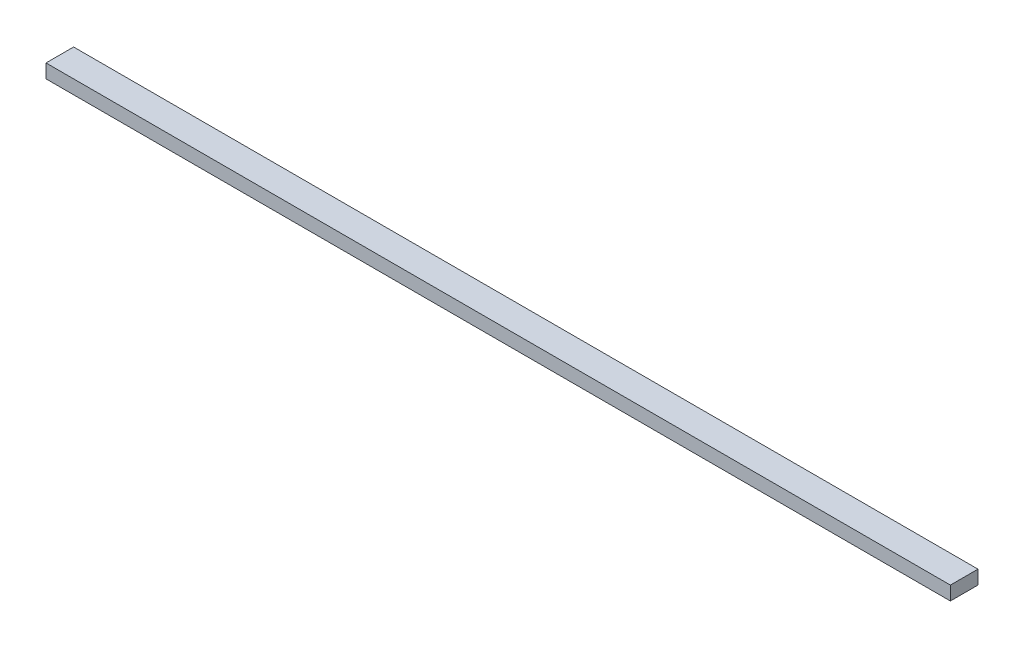
ISO-10303-21;
HEADER;
FILE_DESCRIPTION(('STEP AP214'),'2;1');
FILE_NAME('part.step','',(''),(''),'','','');
FILE_SCHEMA(('AUTOMOTIVE_DESIGN { 1 0 10303 214 1 1 1 1 }'));
ENDSEC;
DATA;
#1=APPLICATION_CONTEXT('core data for automotive mechanical design processes');
#2=APPLICATION_PROTOCOL_DEFINITION('international standard','automotive_design',2000,#1);
#3=PRODUCT_CONTEXT('',#1,'mechanical');
#4=PRODUCT('Part','Part','',(#3));
#5=PRODUCT_RELATED_PRODUCT_CATEGORY('part','',(#4));
#6=PRODUCT_DEFINITION_FORMATION('','',#4);
#7=PRODUCT_DEFINITION_CONTEXT('part definition',#1,'design');
#8=PRODUCT_DEFINITION('design','',#6,#7);
#9=PRODUCT_DEFINITION_SHAPE('','',#8);
#10=(LENGTH_UNIT() NAMED_UNIT(*) SI_UNIT(.MILLI.,.METRE.));
#11=(NAMED_UNIT(*) PLANE_ANGLE_UNIT() SI_UNIT($,.RADIAN.));
#12=(NAMED_UNIT(*) SI_UNIT($,.STERADIAN.) SOLID_ANGLE_UNIT());
#13=UNCERTAINTY_MEASURE_WITH_UNIT(LENGTH_MEASURE(1.E-05),#10,'distance_accuracy_value','');
#14=(GEOMETRIC_REPRESENTATION_CONTEXT(3) GLOBAL_UNCERTAINTY_ASSIGNED_CONTEXT((#13)) GLOBAL_UNIT_ASSIGNED_CONTEXT((#10,
#11,#12)) REPRESENTATION_CONTEXT('',''));
#15=CARTESIAN_POINT('',(0.,0.,0.));
#16=DIRECTION('',(0.,0.,1.));
#17=DIRECTION('',(1.,0.,0.));
#18=AXIS2_PLACEMENT_3D('',#15,#16,#17);
#19=CARTESIAN_POINT('',(-327.5,10.,10.));
#20=DIRECTION('',(1.,0.,0.));
#21=DIRECTION('',(0.,0.,-1.));
#22=AXIS2_PLACEMENT_3D('',#19,#20,#21);
#23=PLANE('',#22);
#24=DIRECTION('',(0.,0.,1.));
#25=VECTOR('',#24,1.);
#26=CARTESIAN_POINT('',(-327.5,0.,10.));
#27=LINE('',#26,#25);
#28=CARTESIAN_POINT('',(-327.5,0.,-9.99999999999996));
#29=VERTEX_POINT('',#28);
#30=CARTESIAN_POINT('',(-327.5,0.,10.));
#31=VERTEX_POINT('',#30);
#32=EDGE_CURVE('E99',#29,#31,#27,.T.);
#33=ORIENTED_EDGE('',*,*,#32,.T.);
#34=DIRECTION('',(0.,-1.,0.));
#35=VECTOR('',#34,1.);
#36=CARTESIAN_POINT('',(-327.5,10.,10.));
#37=LINE('',#36,#35);
#38=CARTESIAN_POINT('',(-327.5,10.,10.));
#39=VERTEX_POINT('',#38);
#40=EDGE_CURVE('E11',#39,#31,#37,.T.);
#41=ORIENTED_EDGE('',*,*,#40,.F.);
#42=DIRECTION('',(0.,0.,1.));
#43=VECTOR('',#42,1.);
#44=CARTESIAN_POINT('',(-327.5,10.,10.));
#45=LINE('',#44,#43);
#46=CARTESIAN_POINT('',(-327.5,10.,-9.99999999999996));
#47=VERTEX_POINT('',#46);
#48=EDGE_CURVE('E87',#47,#39,#45,.T.);
#49=ORIENTED_EDGE('',*,*,#48,.F.);
#50=DIRECTION('',(0.,-1.,0.));
#51=VECTOR('',#50,1.);
#52=CARTESIAN_POINT('',(-327.5,10.,-9.99999999999996));
#53=LINE('',#52,#51);
#54=EDGE_CURVE('E95',#47,#29,#53,.T.);
#55=ORIENTED_EDGE('',*,*,#54,.T.);
#56=EDGE_LOOP('',(#33,#41,#49,#55));
#57=FACE_BOUND('',#56,.T.);
#58=ADVANCED_FACE('F36',(#57),#23,.F.);
#59=CARTESIAN_POINT('',(327.5,10.,9.99999999999996));
#60=DIRECTION('',(0.,0.,-1.));
#61=DIRECTION('',(-1.,0.,0.));
#62=AXIS2_PLACEMENT_3D('',#59,#60,#61);
#63=PLANE('',#62);
#64=DIRECTION('',(1.,0.,0.));
#65=VECTOR('',#64,1.);
#66=CARTESIAN_POINT('',(327.5,0.,9.99999999999996));
#67=LINE('',#66,#65);
#68=CARTESIAN_POINT('',(327.5,0.,9.99999999999996));
#69=VERTEX_POINT('',#68);
#70=EDGE_CURVE('E91',#31,#69,#67,.T.);
#71=ORIENTED_EDGE('',*,*,#70,.T.);
#72=DIRECTION('',(0.,-1.,0.));
#73=VECTOR('',#72,1.);
#74=CARTESIAN_POINT('',(327.5,10.,9.99999999999996));
#75=LINE('',#74,#73);
#76=CARTESIAN_POINT('',(327.5,10.,9.99999999999996));
#77=VERTEX_POINT('',#76);
#78=EDGE_CURVE('E44',#77,#69,#75,.T.);
#79=ORIENTED_EDGE('',*,*,#78,.F.);
#80=DIRECTION('',(1.,0.,0.));
#81=VECTOR('',#80,1.);
#82=CARTESIAN_POINT('',(327.5,10.,9.99999999999996));
#83=LINE('',#82,#81);
#84=EDGE_CURVE('E82',#39,#77,#83,.T.);
#85=ORIENTED_EDGE('',*,*,#84,.F.);
#86=ORIENTED_EDGE('',*,*,#40,.T.);
#87=EDGE_LOOP('',(#71,#79,#85,#86));
#88=FACE_BOUND('',#87,.T.);
#89=ADVANCED_FACE('F90',(#88),#63,.F.);
#90=CARTESIAN_POINT('',(327.5,10.,9.99999999999996));
#91=DIRECTION('',(-1.,0.,0.));
#92=DIRECTION('',(0.,0.,1.));
#93=AXIS2_PLACEMENT_3D('',#90,#91,#92);
#94=PLANE('',#93);
#95=DIRECTION('',(0.,0.,-1.));
#96=VECTOR('',#95,1.);
#97=CARTESIAN_POINT('',(327.5,0.,9.99999999999996));
#98=LINE('',#97,#96);
#99=CARTESIAN_POINT('',(327.5,0.,-10.));
#100=VERTEX_POINT('',#99);
#101=EDGE_CURVE('E69',#69,#100,#98,.T.);
#102=ORIENTED_EDGE('',*,*,#101,.T.);
#103=DIRECTION('',(0.,-1.,0.));
#104=VECTOR('',#103,1.);
#105=CARTESIAN_POINT('',(327.5,10.,-10.));
#106=LINE('',#105,#104);
#107=CARTESIAN_POINT('',(327.5,10.,-10.));
#108=VERTEX_POINT('',#107);
#109=EDGE_CURVE('E92',#108,#100,#106,.T.);
#110=ORIENTED_EDGE('',*,*,#109,.F.);
#111=DIRECTION('',(0.,0.,-1.));
#112=VECTOR('',#111,1.);
#113=CARTESIAN_POINT('',(327.5,10.,9.99999999999996));
#114=LINE('',#113,#112);
#115=EDGE_CURVE('E85',#77,#108,#114,.T.);
#116=ORIENTED_EDGE('',*,*,#115,.F.);
#117=ORIENTED_EDGE('',*,*,#78,.T.);
#118=EDGE_LOOP('',(#102,#110,#116,#117));
#119=FACE_BOUND('',#118,.T.);
#120=ADVANCED_FACE('F93',(#119),#94,.F.);
#121=CARTESIAN_POINT('',(327.5,10.,-10.));
#122=DIRECTION('',(0.,0.,1.));
#123=DIRECTION('',(1.,0.,0.));
#124=AXIS2_PLACEMENT_3D('',#121,#122,#123);
#125=PLANE('',#124);
#126=DIRECTION('',(-1.,0.,0.));
#127=VECTOR('',#126,1.);
#128=CARTESIAN_POINT('',(327.5,0.,-10.));
#129=LINE('',#128,#127);
#130=EDGE_CURVE('E75',#100,#29,#129,.T.);
#131=ORIENTED_EDGE('',*,*,#130,.T.);
#132=ORIENTED_EDGE('',*,*,#54,.F.);
#133=DIRECTION('',(-1.,0.,0.));
#134=VECTOR('',#133,1.);
#135=CARTESIAN_POINT('',(327.5,10.,-10.));
#136=LINE('',#135,#134);
#137=EDGE_CURVE('E52',#108,#47,#136,.T.);
#138=ORIENTED_EDGE('',*,*,#137,.F.);
#139=ORIENTED_EDGE('',*,*,#109,.T.);
#140=EDGE_LOOP('',(#131,#132,#138,#139));
#141=FACE_BOUND('',#140,.T.);
#142=ADVANCED_FACE('F106',(#141),#125,.F.);
#143=CARTESIAN_POINT('',(0.,10.,0.));
#144=DIRECTION('',(0.,1.,0.));
#145=DIRECTION('',(0.,0.,1.));
#146=AXIS2_PLACEMENT_3D('',#143,#144,#145);
#147=PLANE('',#146);
#148=ORIENTED_EDGE('',*,*,#48,.T.);
#149=ORIENTED_EDGE('',*,*,#84,.T.);
#150=ORIENTED_EDGE('',*,*,#115,.T.);
#151=ORIENTED_EDGE('',*,*,#137,.T.);
#152=EDGE_LOOP('',(#148,#149,#150,#151));
#153=FACE_BOUND('',#152,.T.);
#154=ADVANCED_FACE('F83',(#153),#147,.T.);
#155=CARTESIAN_POINT('',(0.,0.,0.));
#156=DIRECTION('',(0.,1.,0.));
#157=DIRECTION('',(0.,0.,1.));
#158=AXIS2_PLACEMENT_3D('',#155,#156,#157);
#159=PLANE('',#158);
#160=ORIENTED_EDGE('',*,*,#32,.F.);
#161=ORIENTED_EDGE('',*,*,#130,.F.);
#162=ORIENTED_EDGE('',*,*,#101,.F.);
#163=ORIENTED_EDGE('',*,*,#70,.F.);
#164=EDGE_LOOP('',(#160,#161,#162,#163));
#165=FACE_BOUND('',#164,.T.);
#166=ADVANCED_FACE('F109',(#165),#159,.F.);
#167=CLOSED_SHELL('',(#58,#89,#120,#142,#154,#166));
#168=MANIFOLD_SOLID_BREP('B2',#167);
#169=ADVANCED_BREP_SHAPE_REPRESENTATION('',(#18,#168),#14);
#170=SHAPE_DEFINITION_REPRESENTATION(#9,#169);
ENDSEC;
END-ISO-10303-21;
